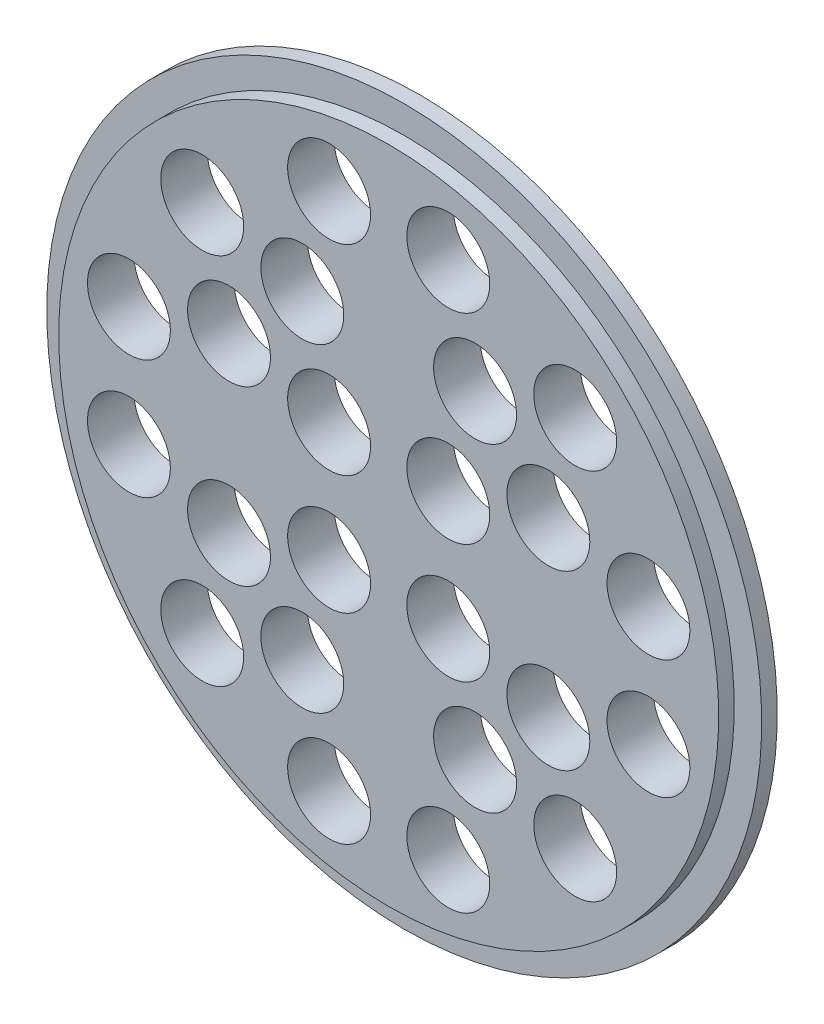
ISO-10303-21;
HEADER;
FILE_DESCRIPTION(('STEP AP214'),'2;1');
FILE_NAME('part.step','',(''),(''),'','','');
FILE_SCHEMA(('AUTOMOTIVE_DESIGN { 1 0 10303 214 1 1 1 1 }'));
ENDSEC;
DATA;
#1=APPLICATION_CONTEXT('core data for automotive mechanical design processes');
#2=APPLICATION_PROTOCOL_DEFINITION('international standard','automotive_design',2000,#1);
#3=PRODUCT_CONTEXT('',#1,'mechanical');
#4=PRODUCT('Part','Part','',(#3));
#5=PRODUCT_RELATED_PRODUCT_CATEGORY('part','',(#4));
#6=PRODUCT_DEFINITION_FORMATION('','',#4);
#7=PRODUCT_DEFINITION_CONTEXT('part definition',#1,'design');
#8=PRODUCT_DEFINITION('design','',#6,#7);
#9=PRODUCT_DEFINITION_SHAPE('','',#8);
#10=(LENGTH_UNIT() NAMED_UNIT(*) SI_UNIT(.MILLI.,.METRE.));
#11=(NAMED_UNIT(*) PLANE_ANGLE_UNIT() SI_UNIT($,.RADIAN.));
#12=(NAMED_UNIT(*) SI_UNIT($,.STERADIAN.) SOLID_ANGLE_UNIT());
#13=UNCERTAINTY_MEASURE_WITH_UNIT(LENGTH_MEASURE(1.E-05),#10,'distance_accuracy_value','');
#14=(GEOMETRIC_REPRESENTATION_CONTEXT(3) GLOBAL_UNCERTAINTY_ASSIGNED_CONTEXT((#13)) GLOBAL_UNIT_ASSIGNED_CONTEXT((#10,
#11,#12)) REPRESENTATION_CONTEXT('',''));
#15=CARTESIAN_POINT('',(0.,0.,0.));
#16=DIRECTION('',(0.,0.,1.));
#17=DIRECTION('',(1.,0.,0.));
#18=AXIS2_PLACEMENT_3D('',#15,#16,#17);
#19=CARTESIAN_POINT('',(0.,0.,0.));
#20=DIRECTION('',(0.,0.,1.));
#21=DIRECTION('',(1.,0.,0.));
#22=AXIS2_PLACEMENT_3D('',#19,#20,#21);
#23=PLANE('',#22);
#24=CARTESIAN_POINT('',(-5.74992085016783,-5.74999999999457,0.));
#25=DIRECTION('',(0.,0.,1.));
#26=DIRECTION('',(1.,0.,0.));
#27=AXIS2_PLACEMENT_3D('',#24,#25,#26);
#28=CIRCLE('',#27,4.);
#29=CARTESIAN_POINT('',(-1.74992085016783,-5.74999999999457,0.));
#30=VERTEX_POINT('',#29);
#31=EDGE_CURVE('E203',#30,#30,#28,.T.);
#32=ORIENTED_EDGE('',*,*,#31,.T.);
#33=EDGE_LOOP('',(#32));
#34=FACE_BOUND('',#33,.T.);
#35=CARTESIAN_POINT('',(-8.33811130120218,-15.4092582628828,0.));
#36=DIRECTION('',(0.,0.,1.));
#37=DIRECTION('',(1.,0.,0.));
#38=AXIS2_PLACEMENT_3D('',#35,#36,#37);
#39=CIRCLE('',#38,4.);
#40=CARTESIAN_POINT('',(-4.33811130120218,-15.4092582628828,0.));
#41=VERTEX_POINT('',#40);
#42=EDGE_CURVE('E197',#41,#41,#39,.T.);
#43=ORIENTED_EDGE('',*,*,#42,.T.);
#44=EDGE_LOOP('',(#43));
#45=FACE_BOUND('',#44,.T.);
#46=CARTESIAN_POINT('',(-17.9973695640953,-17.9974487138989,0.));
#47=DIRECTION('',(0.,0.,1.));
#48=DIRECTION('',(1.,0.,0.));
#49=AXIS2_PLACEMENT_3D('',#46,#47,#48);
#50=CIRCLE('',#49,4.);
#51=CARTESIAN_POINT('',(-13.9973695640953,-17.9974487138989,0.));
#52=VERTEX_POINT('',#51);
#53=EDGE_CURVE('E191',#52,#52,#50,.T.);
#54=ORIENTED_EDGE('',*,*,#53,.T.);
#55=EDGE_LOOP('',(#54));
#56=FACE_BOUND('',#55,.T.);
#57=CARTESIAN_POINT('',(-15.409179113061,-8.33819045101064,0.));
#58=DIRECTION('',(0.,0.,1.));
#59=DIRECTION('',(1.,0.,0.));
#60=AXIS2_PLACEMENT_3D('',#57,#58,#59);
#61=CIRCLE('',#60,3.99999999999999);
#62=CARTESIAN_POINT('',(-11.409179113061,-8.33819045101064,0.));
#63=VERTEX_POINT('',#62);
#64=EDGE_CURVE('E185',#63,#63,#61,.T.);
#65=ORIENTED_EDGE('',*,*,#64,.T.);
#66=EDGE_LOOP('',(#65));
#67=FACE_BOUND('',#66,.T.);
#68=CARTESIAN_POINT('',(-25.0684373759492,-5.74999999997635,0.));
#69=DIRECTION('',(0.,0.,1.));
#70=DIRECTION('',(1.,0.,0.));
#71=AXIS2_PLACEMENT_3D('',#68,#69,#70);
#72=CIRCLE('',#71,3.99999999999999);
#73=CARTESIAN_POINT('',(-21.0684373759492,-5.74999999997635,0.));
#74=VERTEX_POINT('',#73);
#75=EDGE_CURVE('E179',#74,#74,#72,.T.);
#76=ORIENTED_EDGE('',*,*,#75,.T.);
#77=EDGE_LOOP('',(#76));
#78=FACE_BOUND('',#77,.T.);
#79=CARTESIAN_POINT('',(-5.74992085018606,-25.0685165257759,0.));
#80=DIRECTION('',(0.,0.,1.));
#81=DIRECTION('',(1.,0.,0.));
#82=AXIS2_PLACEMENT_3D('',#79,#80,#81);
#83=CIRCLE('',#82,4.00000000000001);
#84=CARTESIAN_POINT('',(-1.74992085018605,-25.0685165257759,0.));
#85=VERTEX_POINT('',#84);
#86=EDGE_CURVE('E173',#85,#85,#83,.T.);
#87=ORIENTED_EDGE('',*,*,#86,.T.);
#88=EDGE_LOOP('',(#87));
#89=FACE_BOUND('',#88,.T.);
#90=CARTESIAN_POINT('',(0.,0.,0.));
#91=DIRECTION('',(0.,0.,-1.));
#92=DIRECTION('',(0.,1.,0.));
#93=AXIS2_PLACEMENT_3D('',#90,#91,#92);
#94=CIRCLE('',#93,31.85);
#95=CARTESIAN_POINT('',(-0.774999999999998,-31.8405696400049,0.));
#96=VERTEX_POINT('',#95);
#97=CARTESIAN_POINT('',(-31.8405696400049,-0.775000000000002,0.));
#98=VERTEX_POINT('',#97);
#99=EDGE_CURVE('E121',#96,#98,#94,.T.);
#100=ORIENTED_EDGE('',*,*,#99,.T.);
#101=DIRECTION('',(1.,0.,0.));
#102=VECTOR('',#101,1.);
#103=CARTESIAN_POINT('',(-34.5,-0.775000000000002,0.));
#104=LINE('',#103,#102);
#105=CARTESIAN_POINT('',(-0.774999999999998,-0.775000000000002,0.));
#106=VERTEX_POINT('',#105);
#107=EDGE_CURVE('E108',#98,#106,#104,.T.);
#108=ORIENTED_EDGE('',*,*,#107,.T.);
#109=DIRECTION('',(0.,1.,0.));
#110=VECTOR('',#109,1.);
#111=CARTESIAN_POINT('',(-0.774999999999998,-34.5,0.));
#112=LINE('',#111,#110);
#113=EDGE_CURVE('E297',#96,#106,#112,.T.);
#114=ORIENTED_EDGE('',*,*,#113,.F.);
#115=EDGE_LOOP('',(#100,#108,#114));
#116=FACE_BOUND('',#115,.T.);
#117=ADVANCED_FACE('F37',(#34,#45,#56,#67,#78,#89,#116),#23,.F.);
#118=CARTESIAN_POINT('',(0.,0.,0.));
#119=DIRECTION('',(0.,0.,-1.));
#120=DIRECTION('',(0.,1.,0.));
#121=AXIS2_PLACEMENT_3D('',#118,#119,#120);
#122=CYLINDRICAL_SURFACE('',#121,31.85);
#123=CARTESIAN_POINT('',(0.,0.,1.49999999999999));
#124=DIRECTION('',(0.,0.,-1.));
#125=DIRECTION('',(0.,1.,0.));
#126=AXIS2_PLACEMENT_3D('',#123,#124,#125);
#127=CIRCLE('',#126,31.85);
#128=CARTESIAN_POINT('',(-0.775,-31.8405696400049,1.49999999999999));
#129=VERTEX_POINT('',#128);
#130=CARTESIAN_POINT('',(-31.8405696400049,-0.775000000000002,1.49999999999999));
#131=VERTEX_POINT('',#130);
#132=EDGE_CURVE('E127',#129,#131,#127,.T.);
#133=ORIENTED_EDGE('',*,*,#132,.T.);
#134=DIRECTION('',(0.,0.,-1.));
#135=VECTOR('',#134,1.);
#136=CARTESIAN_POINT('',(-31.8405696400049,-0.775000000000002,0.));
#137=LINE('',#136,#135);
#138=EDGE_CURVE('E107',#131,#98,#137,.T.);
#139=ORIENTED_EDGE('',*,*,#138,.T.);
#140=ORIENTED_EDGE('',*,*,#99,.F.);
#141=DIRECTION('',(0.,0.,-1.));
#142=VECTOR('',#141,1.);
#143=CARTESIAN_POINT('',(-0.774999999999998,-31.8405696400049,0.));
#144=LINE('',#143,#142);
#145=EDGE_CURVE('E312',#96,#129,#144,.F.);
#146=ORIENTED_EDGE('',*,*,#145,.T.);
#147=EDGE_LOOP('',(#133,#139,#140,#146));
#148=FACE_BOUND('',#147,.T.);
#149=ADVANCED_FACE('F349',(#148),#122,.T.);
#150=CARTESIAN_POINT('',(-0.774999999999998,-34.5,0.));
#151=DIRECTION('',(-1.,0.,0.));
#152=DIRECTION('',(0.,0.,1.));
#153=AXIS2_PLACEMENT_3D('',#150,#151,#152);
#154=PLANE('',#153);
#155=ORIENTED_EDGE('',*,*,#113,.T.);
#156=DIRECTION('',(0.,0.,1.));
#157=VECTOR('',#156,1.);
#158=CARTESIAN_POINT('',(-0.774999999999998,-0.775000000000005,0.));
#159=LINE('',#158,#157);
#160=CARTESIAN_POINT('',(-0.774999999999998,-0.775000000000002,1.49999999999999));
#161=VERTEX_POINT('',#160);
#162=EDGE_CURVE('E11',#106,#161,#159,.T.);
#163=ORIENTED_EDGE('',*,*,#162,.T.);
#164=DIRECTION('',(0.,1.,0.));
#165=VECTOR('',#164,1.);
#166=CARTESIAN_POINT('',(-0.775,-34.5,1.49999999999999));
#167=LINE('',#166,#165);
#168=EDGE_CURVE('E304',#129,#161,#167,.T.);
#169=ORIENTED_EDGE('',*,*,#168,.F.);
#170=ORIENTED_EDGE('',*,*,#145,.F.);
#171=EDGE_LOOP('',(#155,#163,#169,#170));
#172=FACE_BOUND('',#171,.T.);
#173=ADVANCED_FACE('F355',(#172),#154,.F.);
#174=CARTESIAN_POINT('',(-25.0684769508544,5.74996042511669,0.));
#175=DIRECTION('',(0.,0.,1.));
#176=DIRECTION('',(1.,0.,0.));
#177=AXIS2_PLACEMENT_3D('',#174,#175,#176);
#178=CIRCLE('',#177,3.99999999999999);
#179=CARTESIAN_POINT('',(-21.0684769508544,5.74996042511669,0.));
#180=VERTEX_POINT('',#179);
#181=EDGE_CURVE('E132',#180,#180,#178,.T.);
#182=ORIENTED_EDGE('',*,*,#181,.T.);
#183=EDGE_LOOP('',(#182));
#184=FACE_BOUND('',#183,.T.);
#185=CARTESIAN_POINT('',(-5.74996042504572,25.0684769508707,0.));
#186=DIRECTION('',(0.,0.,1.));
#187=DIRECTION('',(1.,0.,0.));
#188=AXIS2_PLACEMENT_3D('',#185,#186,#187);
#189=CIRCLE('',#188,4.00000000000001);
#190=CARTESIAN_POINT('',(-1.7499604250457,25.0684769508707,0.));
#191=VERTEX_POINT('',#190);
#192=EDGE_CURVE('E142',#191,#191,#189,.T.);
#193=ORIENTED_EDGE('',*,*,#192,.T.);
#194=EDGE_LOOP('',(#193));
#195=FACE_BOUND('',#194,.T.);
#196=CARTESIAN_POINT('',(-8.33815087608457,15.4092186879837,0.));
#197=DIRECTION('',(0.,0.,1.));
#198=DIRECTION('',(1.,0.,0.));
#199=AXIS2_PLACEMENT_3D('',#196,#197,#198);
#200=CIRCLE('',#199,4.);
#201=CARTESIAN_POINT('',(-4.33815087608457,15.4092186879837,0.));
#202=VERTEX_POINT('',#201);
#203=EDGE_CURVE('E149',#202,#202,#200,.T.);
#204=ORIENTED_EDGE('',*,*,#203,.T.);
#205=EDGE_LOOP('',(#204));
#206=FACE_BOUND('',#205,.T.);
#207=CARTESIAN_POINT('',(-17.9974091389716,17.9974091390226,0.));
#208=DIRECTION('',(0.,0.,1.));
#209=DIRECTION('',(1.,0.,0.));
#210=AXIS2_PLACEMENT_3D('',#207,#208,#209);
#211=CIRCLE('',#210,4.);
#212=CARTESIAN_POINT('',(-13.9974091389716,17.9974091390226,0.));
#213=VERTEX_POINT('',#212);
#214=EDGE_CURVE('E155',#213,#213,#211,.T.);
#215=ORIENTED_EDGE('',*,*,#214,.T.);
#216=EDGE_LOOP('',(#215));
#217=FACE_BOUND('',#216,.T.);
#218=CARTESIAN_POINT('',(-15.4092186879601,8.33815087612825,0.));
#219=DIRECTION('',(0.,0.,1.));
#220=DIRECTION('',(1.,0.,0.));
#221=AXIS2_PLACEMENT_3D('',#218,#219,#220);
#222=CIRCLE('',#221,4.);
#223=CARTESIAN_POINT('',(-11.4092186879601,8.33815087612825,0.));
#224=VERTEX_POINT('',#223);
#225=EDGE_CURVE('E161',#224,#224,#222,.T.);
#226=ORIENTED_EDGE('',*,*,#225,.T.);
#227=EDGE_LOOP('',(#226));
#228=FACE_BOUND('',#227,.T.);
#229=CARTESIAN_POINT('',(-5.74996042507306,5.74996042508934,0.));
#230=DIRECTION('',(0.,0.,1.));
#231=DIRECTION('',(1.,0.,0.));
#232=AXIS2_PLACEMENT_3D('',#229,#230,#231);
#233=CIRCLE('',#232,4.);
#234=CARTESIAN_POINT('',(-1.74996042507306,5.74996042508934,0.));
#235=VERTEX_POINT('',#234);
#236=EDGE_CURVE('E167',#235,#235,#233,.T.);
#237=ORIENTED_EDGE('',*,*,#236,.T.);
#238=EDGE_LOOP('',(#237));
#239=FACE_BOUND('',#238,.T.);
#240=CARTESIAN_POINT('',(-0.774999999999998,0.774999999999998,0.));
#241=VERTEX_POINT('',#240);
#242=CARTESIAN_POINT('',(-0.774999999999998,31.8405696400049,0.));
#243=VERTEX_POINT('',#242);
#244=EDGE_CURVE('E115',#241,#243,#112,.T.);
#245=ORIENTED_EDGE('',*,*,#244,.F.);
#246=DIRECTION('',(1.,0.,0.));
#247=VECTOR('',#246,1.);
#248=CARTESIAN_POINT('',(-34.5,0.774999999999998,0.));
#249=LINE('',#248,#247);
#250=CARTESIAN_POINT('',(-31.8405696400049,0.774999999999998,0.));
#251=VERTEX_POINT('',#250);
#252=EDGE_CURVE('E52',#251,#241,#249,.T.);
#253=ORIENTED_EDGE('',*,*,#252,.F.);
#254=EDGE_CURVE('E113',#251,#243,#94,.T.);
#255=ORIENTED_EDGE('',*,*,#254,.T.);
#256=EDGE_LOOP('',(#245,#253,#255));
#257=FACE_BOUND('',#256,.T.);
#258=ADVANCED_FACE('F112',(#184,#195,#206,#217,#228,#239,#257),#23,.F.);
#259=ORIENTED_EDGE('',*,*,#254,.F.);
#260=DIRECTION('',(0.,0.,-1.));
#261=VECTOR('',#260,1.);
#262=CARTESIAN_POINT('',(-31.8405696400049,0.774999999999998,0.));
#263=LINE('',#262,#261);
#264=CARTESIAN_POINT('',(-31.8405696400049,0.775,1.49999999999999));
#265=VERTEX_POINT('',#264);
#266=EDGE_CURVE('E100',#251,#265,#263,.F.);
#267=ORIENTED_EDGE('',*,*,#266,.T.);
#268=CARTESIAN_POINT('',(-0.775,31.8405696400049,1.49999999999999));
#269=VERTEX_POINT('',#268);
#270=EDGE_CURVE('E129',#265,#269,#127,.T.);
#271=ORIENTED_EDGE('',*,*,#270,.T.);
#272=DIRECTION('',(0.,0.,-1.));
#273=VECTOR('',#272,1.);
#274=CARTESIAN_POINT('',(-0.774999999999998,31.8405696400049,0.));
#275=LINE('',#274,#273);
#276=EDGE_CURVE('E120',#269,#243,#275,.T.);
#277=ORIENTED_EDGE('',*,*,#276,.T.);
#278=EDGE_LOOP('',(#259,#267,#271,#277));
#279=FACE_BOUND('',#278,.T.);
#280=ADVANCED_FACE('F118',(#279),#122,.T.);
#281=CARTESIAN_POINT('',(0.,0.,4.5));
#282=DIRECTION('',(0.,0.,1.));
#283=DIRECTION('',(1.,0.,0.));
#284=AXIS2_PLACEMENT_3D('',#281,#282,#283);
#285=PLANE('',#284);
#286=CARTESIAN_POINT('',(0.,0.,4.49999999999999));
#287=DIRECTION('',(0.,0.,-1.));
#288=DIRECTION('',(0.,1.,0.));
#289=AXIS2_PLACEMENT_3D('',#286,#287,#288);
#290=CIRCLE('',#289,31.85);
#291=CARTESIAN_POINT('',(0.,31.85,4.5));
#292=VERTEX_POINT('',#291);
#293=EDGE_CURVE('E319',#292,#292,#290,.T.);
#294=ORIENTED_EDGE('',*,*,#293,.F.);
#295=EDGE_LOOP('',(#294));
#296=FACE_BOUND('',#295,.T.);
#297=CARTESIAN_POINT('',(-5.74996042504572,25.0684769508707,4.5));
#298=DIRECTION('',(0.,0.,1.));
#299=DIRECTION('',(1.,0.,0.));
#300=AXIS2_PLACEMENT_3D('',#297,#298,#299);
#301=CIRCLE('',#300,4.00000000000001);
#302=CARTESIAN_POINT('',(-1.7499604250457,25.0684769508707,4.5));
#303=VERTEX_POINT('',#302);
#304=EDGE_CURVE('E146',#303,#303,#301,.T.);
#305=ORIENTED_EDGE('',*,*,#304,.F.);
#306=EDGE_LOOP('',(#305));
#307=FACE_BOUND('',#306,.T.);
#308=CARTESIAN_POINT('',(-17.9974091389716,17.9974091390226,4.5));
#309=DIRECTION('',(0.,0.,1.));
#310=DIRECTION('',(1.,0.,0.));
#311=AXIS2_PLACEMENT_3D('',#308,#309,#310);
#312=CIRCLE('',#311,4.);
#313=CARTESIAN_POINT('',(-13.9974091389716,17.9974091390226,4.5));
#314=VERTEX_POINT('',#313);
#315=EDGE_CURVE('E158',#314,#314,#312,.T.);
#316=ORIENTED_EDGE('',*,*,#315,.F.);
#317=EDGE_LOOP('',(#316));
#318=FACE_BOUND('',#317,.T.);
#319=CARTESIAN_POINT('',(-5.74996042507306,5.74996042508934,4.5));
#320=DIRECTION('',(0.,0.,1.));
#321=DIRECTION('',(1.,0.,0.));
#322=AXIS2_PLACEMENT_3D('',#319,#320,#321);
#323=CIRCLE('',#322,4.);
#324=CARTESIAN_POINT('',(-1.74996042507306,5.74996042508934,4.5));
#325=VERTEX_POINT('',#324);
#326=EDGE_CURVE('E170',#325,#325,#323,.T.);
#327=ORIENTED_EDGE('',*,*,#326,.F.);
#328=EDGE_LOOP('',(#327));
#329=FACE_BOUND('',#328,.T.);
#330=CARTESIAN_POINT('',(-25.0684373759492,-5.74999999997635,4.5));
#331=DIRECTION('',(0.,0.,1.));
#332=DIRECTION('',(1.,0.,0.));
#333=AXIS2_PLACEMENT_3D('',#330,#331,#332);
#334=CIRCLE('',#333,3.99999999999999);
#335=CARTESIAN_POINT('',(-21.0684373759492,-5.74999999997635,4.5));
#336=VERTEX_POINT('',#335);
#337=EDGE_CURVE('E182',#336,#336,#334,.T.);
#338=ORIENTED_EDGE('',*,*,#337,.F.);
#339=EDGE_LOOP('',(#338));
#340=FACE_BOUND('',#339,.T.);
#341=CARTESIAN_POINT('',(-17.9973695640953,-17.9974487138989,4.5));
#342=DIRECTION('',(0.,0.,1.));
#343=DIRECTION('',(1.,0.,0.));
#344=AXIS2_PLACEMENT_3D('',#341,#342,#343);
#345=CIRCLE('',#344,4.);
#346=CARTESIAN_POINT('',(-13.9973695640953,-17.9974487138989,4.5));
#347=VERTEX_POINT('',#346);
#348=EDGE_CURVE('E194',#347,#347,#345,.T.);
#349=ORIENTED_EDGE('',*,*,#348,.F.);
#350=EDGE_LOOP('',(#349));
#351=FACE_BOUND('',#350,.T.);
#352=CARTESIAN_POINT('',(-5.74992085016783,-5.74999999999457,4.5));
#353=DIRECTION('',(0.,0.,1.));
#354=DIRECTION('',(1.,0.,0.));
#355=AXIS2_PLACEMENT_3D('',#352,#353,#354);
#356=CIRCLE('',#355,4.);
#357=CARTESIAN_POINT('',(-1.74992085016783,-5.74999999999457,4.5));
#358=VERTEX_POINT('',#357);
#359=EDGE_CURVE('E206',#358,#358,#356,.T.);
#360=ORIENTED_EDGE('',*,*,#359,.F.);
#361=EDGE_LOOP('',(#360));
#362=FACE_BOUND('',#361,.T.);
#363=CARTESIAN_POINT('',(5.75003957490697,-25.0684769508653,4.5));
#364=DIRECTION('',(0.,0.,1.));
#365=DIRECTION('',(1.,0.,0.));
#366=AXIS2_PLACEMENT_3D('',#363,#364,#365);
#367=CIRCLE('',#366,4.00000000000001);
#368=CARTESIAN_POINT('',(9.75003957490698,-25.0684769508653,4.5));
#369=VERTEX_POINT('',#368);
#370=EDGE_CURVE('E218',#369,#369,#367,.T.);
#371=ORIENTED_EDGE('',*,*,#370,.F.);
#372=EDGE_LOOP('',(#371));
#373=FACE_BOUND('',#372,.T.);
#374=CARTESIAN_POINT('',(17.9974882888262,-17.9974091390056,4.5));
#375=DIRECTION('',(0.,0.,1.));
#376=DIRECTION('',(1.,0.,0.));
#377=AXIS2_PLACEMENT_3D('',#374,#375,#376);
#378=CIRCLE('',#377,3.99999999999999);
#379=CARTESIAN_POINT('',(21.9974882888262,-17.9974091390056,4.5));
#380=VERTEX_POINT('',#379);
#381=EDGE_CURVE('E230',#380,#380,#378,.T.);
#382=ORIENTED_EDGE('',*,*,#381,.F.);
#383=EDGE_LOOP('',(#382));
#384=FACE_BOUND('',#383,.T.);
#385=CARTESIAN_POINT('',(5.75003957491608,-5.74996042508392,4.5));
#386=DIRECTION('',(0.,0.,1.));
#387=DIRECTION('',(1.,0.,0.));
#388=AXIS2_PLACEMENT_3D('',#385,#386,#387);
#389=CIRCLE('',#388,3.99999999999999);
#390=CARTESIAN_POINT('',(9.75003957491608,-5.74996042508392,4.5));
#391=VERTEX_POINT('',#390);
#392=EDGE_CURVE('E242',#391,#391,#389,.T.);
#393=ORIENTED_EDGE('',*,*,#392,.F.);
#394=EDGE_LOOP('',(#393));
#395=FACE_BOUND('',#394,.T.);
#396=CARTESIAN_POINT('',(25.0685165257814,5.75,4.5));
#397=DIRECTION('',(0.,0.,1.));
#398=DIRECTION('',(1.,0.,0.));
#399=AXIS2_PLACEMENT_3D('',#396,#397,#398);
#400=CIRCLE('',#399,4.00000000000003);
#401=CARTESIAN_POINT('',(29.0685165257814,5.75,4.5));
#402=VERTEX_POINT('',#401);
#403=EDGE_CURVE('E254',#402,#402,#400,.T.);
#404=ORIENTED_EDGE('',*,*,#403,.F.);
#405=EDGE_LOOP('',(#404));
#406=FACE_BOUND('',#405,.T.);
#407=CARTESIAN_POINT('',(17.9974487139159,17.9974487139159,4.5));
#408=DIRECTION('',(0.,0.,1.));
#409=DIRECTION('',(1.,0.,0.));
#410=AXIS2_PLACEMENT_3D('',#407,#408,#409);
#411=CIRCLE('',#410,3.99999999999999);
#412=CARTESIAN_POINT('',(21.9974487139159,17.9974487139159,4.5));
#413=VERTEX_POINT('',#412);
#414=EDGE_CURVE('E266',#413,#413,#411,.T.);
#415=ORIENTED_EDGE('',*,*,#414,.F.);
#416=EDGE_LOOP('',(#415));
#417=FACE_BOUND('',#416,.T.);
#418=CARTESIAN_POINT('',(5.75,5.75,4.5));
#419=DIRECTION('',(0.,0.,1.));
#420=DIRECTION('',(1.,0.,0.));
#421=AXIS2_PLACEMENT_3D('',#418,#419,#420);
#422=CIRCLE('',#421,4.);
#423=CARTESIAN_POINT('',(9.75,5.75,4.5));
#424=VERTEX_POINT('',#423);
#425=EDGE_CURVE('E278',#424,#424,#422,.T.);
#426=ORIENTED_EDGE('',*,*,#425,.F.);
#427=EDGE_LOOP('',(#426));
#428=FACE_BOUND('',#427,.T.);
#429=CARTESIAN_POINT('',(8.33819045102524,15.4092582628907,4.5));
#430=DIRECTION('',(0.,0.,1.));
#431=DIRECTION('',(1.,0.,0.));
#432=AXIS2_PLACEMENT_3D('',#429,#430,#431);
#433=CIRCLE('',#432,4.00000000000001);
#434=CARTESIAN_POINT('',(12.3381904510252,15.4092582628907,4.5));
#435=VERTEX_POINT('',#434);
#436=EDGE_CURVE('E272',#435,#435,#433,.T.);
#437=ORIENTED_EDGE('',*,*,#436,.F.);
#438=EDGE_LOOP('',(#437));
#439=FACE_BOUND('',#438,.T.);
#440=CARTESIAN_POINT('',(15.4092582628907,8.33819045102518,4.5));
#441=DIRECTION('',(0.,0.,1.));
#442=DIRECTION('',(1.,0.,0.));
#443=AXIS2_PLACEMENT_3D('',#440,#441,#442);
#444=CIRCLE('',#443,3.99999999999999);
#445=CARTESIAN_POINT('',(19.4092582628907,8.33819045102518,4.5));
#446=VERTEX_POINT('',#445);
#447=EDGE_CURVE('E260',#446,#446,#444,.T.);
#448=ORIENTED_EDGE('',*,*,#447,.F.);
#449=EDGE_LOOP('',(#448));
#450=FACE_BOUND('',#449,.T.);
#451=CARTESIAN_POINT('',(5.75,25.0685165257813,4.5));
#452=DIRECTION('',(0.,0.,1.));
#453=DIRECTION('',(1.,0.,0.));
#454=AXIS2_PLACEMENT_3D('',#451,#452,#453);
#455=CIRCLE('',#454,4.00000000000001);
#456=CARTESIAN_POINT('',(9.75000000000001,25.0685165257813,4.5));
#457=VERTEX_POINT('',#456);
#458=EDGE_CURVE('E248',#457,#457,#455,.T.);
#459=ORIENTED_EDGE('',*,*,#458,.F.);
#460=EDGE_LOOP('',(#459));
#461=FACE_BOUND('',#460,.T.);
#462=CARTESIAN_POINT('',(15.4092978378055,-8.33815087611371,4.5));
#463=DIRECTION('',(0.,0.,1.));
#464=DIRECTION('',(1.,0.,0.));
#465=AXIS2_PLACEMENT_3D('',#462,#463,#464);
#466=CIRCLE('',#465,3.99999999999999);
#467=CARTESIAN_POINT('',(19.4092978378055,-8.33815087611371,4.5));
#468=VERTEX_POINT('',#467);
#469=EDGE_CURVE('E236',#468,#468,#466,.T.);
#470=ORIENTED_EDGE('',*,*,#469,.F.);
#471=EDGE_LOOP('',(#470));
#472=FACE_BOUND('',#471,.T.);
#473=CARTESIAN_POINT('',(8.33823002593671,-15.4092186879758,4.5));
#474=DIRECTION('',(0.,0.,1.));
#475=DIRECTION('',(1.,0.,0.));
#476=AXIS2_PLACEMENT_3D('',#473,#474,#475);
#477=CIRCLE('',#476,4.);
#478=CARTESIAN_POINT('',(12.3382300259367,-15.4092186879758,4.5));
#479=VERTEX_POINT('',#478);
#480=EDGE_CURVE('E224',#479,#479,#477,.T.);
#481=ORIENTED_EDGE('',*,*,#480,.F.);
#482=EDGE_LOOP('',(#481));
#483=FACE_BOUND('',#482,.T.);
#484=CARTESIAN_POINT('',(25.0685561006974,-5.74996042509303,4.5));
#485=DIRECTION('',(0.,0.,1.));
#486=DIRECTION('',(1.,0.,0.));
#487=AXIS2_PLACEMENT_3D('',#484,#485,#486);
#488=CIRCLE('',#487,4.00000000000002);
#489=CARTESIAN_POINT('',(29.0685561006975,-5.74996042509303,4.5));
#490=VERTEX_POINT('',#489);
#491=EDGE_CURVE('E212',#490,#490,#488,.T.);
#492=ORIENTED_EDGE('',*,*,#491,.F.);
#493=EDGE_LOOP('',(#492));
#494=FACE_BOUND('',#493,.T.);
#495=CARTESIAN_POINT('',(-8.33811130120218,-15.4092582628828,4.5));
#496=DIRECTION('',(0.,0.,1.));
#497=DIRECTION('',(1.,0.,0.));
#498=AXIS2_PLACEMENT_3D('',#495,#496,#497);
#499=CIRCLE('',#498,4.);
#500=CARTESIAN_POINT('',(-4.33811130120218,-15.4092582628828,4.5));
#501=VERTEX_POINT('',#500);
#502=EDGE_CURVE('E200',#501,#501,#499,.T.);
#503=ORIENTED_EDGE('',*,*,#502,.F.);
#504=EDGE_LOOP('',(#503));
#505=FACE_BOUND('',#504,.T.);
#506=CARTESIAN_POINT('',(-15.409179113061,-8.33819045101064,4.5));
#507=DIRECTION('',(0.,0.,1.));
#508=DIRECTION('',(1.,0.,0.));
#509=AXIS2_PLACEMENT_3D('',#506,#507,#508);
#510=CIRCLE('',#509,3.99999999999999);
#511=CARTESIAN_POINT('',(-11.409179113061,-8.33819045101064,4.5));
#512=VERTEX_POINT('',#511);
#513=EDGE_CURVE('E188',#512,#512,#510,.T.);
#514=ORIENTED_EDGE('',*,*,#513,.F.);
#515=EDGE_LOOP('',(#514));
#516=FACE_BOUND('',#515,.T.);
#517=CARTESIAN_POINT('',(-5.74992085018606,-25.0685165257759,4.5));
#518=DIRECTION('',(0.,0.,1.));
#519=DIRECTION('',(1.,0.,0.));
#520=AXIS2_PLACEMENT_3D('',#517,#518,#519);
#521=CIRCLE('',#520,4.00000000000001);
#522=CARTESIAN_POINT('',(-1.74992085018605,-25.0685165257759,4.5));
#523=VERTEX_POINT('',#522);
#524=EDGE_CURVE('E176',#523,#523,#521,.T.);
#525=ORIENTED_EDGE('',*,*,#524,.F.);
#526=EDGE_LOOP('',(#525));
#527=FACE_BOUND('',#526,.T.);
#528=CARTESIAN_POINT('',(-15.4092186879601,8.33815087612825,4.5));
#529=DIRECTION('',(0.,0.,1.));
#530=DIRECTION('',(1.,0.,0.));
#531=AXIS2_PLACEMENT_3D('',#528,#529,#530);
#532=CIRCLE('',#531,4.);
#533=CARTESIAN_POINT('',(-11.4092186879601,8.33815087612825,4.5));
#534=VERTEX_POINT('',#533);
#535=EDGE_CURVE('E164',#534,#534,#532,.T.);
#536=ORIENTED_EDGE('',*,*,#535,.F.);
#537=EDGE_LOOP('',(#536));
#538=FACE_BOUND('',#537,.T.);
#539=CARTESIAN_POINT('',(-8.33815087608457,15.4092186879837,4.5));
#540=DIRECTION('',(0.,0.,1.));
#541=DIRECTION('',(1.,0.,0.));
#542=AXIS2_PLACEMENT_3D('',#539,#540,#541);
#543=CIRCLE('',#542,4.);
#544=CARTESIAN_POINT('',(-4.33815087608457,15.4092186879837,4.5));
#545=VERTEX_POINT('',#544);
#546=EDGE_CURVE('E152',#545,#545,#543,.T.);
#547=ORIENTED_EDGE('',*,*,#546,.F.);
#548=EDGE_LOOP('',(#547));
#549=FACE_BOUND('',#548,.T.);
#550=CARTESIAN_POINT('',(-25.0684769508544,5.74996042511669,4.5));
#551=DIRECTION('',(0.,0.,1.));
#552=DIRECTION('',(1.,0.,0.));
#553=AXIS2_PLACEMENT_3D('',#550,#551,#552);
#554=CIRCLE('',#553,3.99999999999999);
#555=CARTESIAN_POINT('',(-21.0684769508544,5.74996042511669,4.5));
#556=VERTEX_POINT('',#555);
#557=EDGE_CURVE('E137',#556,#556,#554,.T.);
#558=ORIENTED_EDGE('',*,*,#557,.F.);
#559=EDGE_LOOP('',(#558));
#560=FACE_BOUND('',#559,.T.);
#561=ADVANCED_FACE('F363',(#296,#307,#318,#329,#340,#351,#362,#373,#384,#395,#406,#417,#428,
#439,#450,#461,#472,#483,#494,#505,#516,#527,#538,#549,#560),#285,.T.);
#562=CARTESIAN_POINT('',(0.775,31.8405696400049,0.));
#563=VERTEX_POINT('',#562);
#564=CARTESIAN_POINT('',(0.775,-31.8405696400049,0.));
#565=VERTEX_POINT('',#564);
#566=EDGE_CURVE('E124',#563,#565,#94,.T.);
#567=ORIENTED_EDGE('',*,*,#566,.T.);
#568=DIRECTION('',(0.,1.,0.));
#569=VECTOR('',#568,1.);
#570=CARTESIAN_POINT('',(0.775,-34.5,0.));
#571=LINE('',#570,#569);
#572=EDGE_CURVE('E301',#565,#563,#571,.T.);
#573=ORIENTED_EDGE('',*,*,#572,.T.);
#574=EDGE_LOOP('',(#567,#573));
#575=FACE_BOUND('',#574,.T.);
#576=CARTESIAN_POINT('',(5.75,5.75,0.));
#577=DIRECTION('',(0.,0.,1.));
#578=DIRECTION('',(1.,0.,0.));
#579=AXIS2_PLACEMENT_3D('',#576,#577,#578);
#580=CIRCLE('',#579,4.);
#581=CARTESIAN_POINT('',(9.75,5.75,0.));
#582=VERTEX_POINT('',#581);
#583=EDGE_CURVE('E275',#582,#582,#580,.T.);
#584=ORIENTED_EDGE('',*,*,#583,.T.);
#585=EDGE_LOOP('',(#584));
#586=FACE_BOUND('',#585,.T.);
#587=CARTESIAN_POINT('',(8.33819045102524,15.4092582628907,0.));
#588=DIRECTION('',(0.,0.,1.));
#589=DIRECTION('',(1.,0.,0.));
#590=AXIS2_PLACEMENT_3D('',#587,#588,#589);
#591=CIRCLE('',#590,4.00000000000001);
#592=CARTESIAN_POINT('',(12.3381904510252,15.4092582628907,0.));
#593=VERTEX_POINT('',#592);
#594=EDGE_CURVE('E269',#593,#593,#591,.T.);
#595=ORIENTED_EDGE('',*,*,#594,.T.);
#596=EDGE_LOOP('',(#595));
#597=FACE_BOUND('',#596,.T.);
#598=CARTESIAN_POINT('',(17.9974487139159,17.9974487139159,0.));
#599=DIRECTION('',(0.,0.,1.));
#600=DIRECTION('',(1.,0.,0.));
#601=AXIS2_PLACEMENT_3D('',#598,#599,#600);
#602=CIRCLE('',#601,3.99999999999999);
#603=CARTESIAN_POINT('',(21.9974487139159,17.9974487139159,0.));
#604=VERTEX_POINT('',#603);
#605=EDGE_CURVE('E263',#604,#604,#602,.T.);
#606=ORIENTED_EDGE('',*,*,#605,.T.);
#607=EDGE_LOOP('',(#606));
#608=FACE_BOUND('',#607,.T.);
#609=CARTESIAN_POINT('',(15.4092582628907,8.33819045102518,0.));
#610=DIRECTION('',(0.,0.,1.));
#611=DIRECTION('',(1.,0.,0.));
#612=AXIS2_PLACEMENT_3D('',#609,#610,#611);
#613=CIRCLE('',#612,3.99999999999999);
#614=CARTESIAN_POINT('',(19.4092582628907,8.33819045102518,0.));
#615=VERTEX_POINT('',#614);
#616=EDGE_CURVE('E257',#615,#615,#613,.T.);
#617=ORIENTED_EDGE('',*,*,#616,.T.);
#618=EDGE_LOOP('',(#617));
#619=FACE_BOUND('',#618,.T.);
#620=CARTESIAN_POINT('',(25.0685165257814,5.75,0.));
#621=DIRECTION('',(0.,0.,1.));
#622=DIRECTION('',(1.,0.,0.));
#623=AXIS2_PLACEMENT_3D('',#620,#621,#622);
#624=CIRCLE('',#623,4.00000000000003);
#625=CARTESIAN_POINT('',(29.0685165257814,5.75,0.));
#626=VERTEX_POINT('',#625);
#627=EDGE_CURVE('E251',#626,#626,#624,.T.);
#628=ORIENTED_EDGE('',*,*,#627,.T.);
#629=EDGE_LOOP('',(#628));
#630=FACE_BOUND('',#629,.T.);
#631=CARTESIAN_POINT('',(5.75,25.0685165257813,0.));
#632=DIRECTION('',(0.,0.,1.));
#633=DIRECTION('',(1.,0.,0.));
#634=AXIS2_PLACEMENT_3D('',#631,#632,#633);
#635=CIRCLE('',#634,4.00000000000001);
#636=CARTESIAN_POINT('',(9.75000000000001,25.0685165257813,0.));
#637=VERTEX_POINT('',#636);
#638=EDGE_CURVE('E245',#637,#637,#635,.T.);
#639=ORIENTED_EDGE('',*,*,#638,.T.);
#640=EDGE_LOOP('',(#639));
#641=FACE_BOUND('',#640,.T.);
#642=CARTESIAN_POINT('',(5.75003957491608,-5.74996042508392,0.));
#643=DIRECTION('',(0.,0.,1.));
#644=DIRECTION('',(1.,0.,0.));
#645=AXIS2_PLACEMENT_3D('',#642,#643,#644);
#646=CIRCLE('',#645,3.99999999999999);
#647=CARTESIAN_POINT('',(9.75003957491608,-5.74996042508392,0.));
#648=VERTEX_POINT('',#647);
#649=EDGE_CURVE('E239',#648,#648,#646,.T.);
#650=ORIENTED_EDGE('',*,*,#649,.T.);
#651=EDGE_LOOP('',(#650));
#652=FACE_BOUND('',#651,.T.);
#653=CARTESIAN_POINT('',(15.4092978378055,-8.33815087611371,0.));
#654=DIRECTION('',(0.,0.,1.));
#655=DIRECTION('',(1.,0.,0.));
#656=AXIS2_PLACEMENT_3D('',#653,#654,#655);
#657=CIRCLE('',#656,3.99999999999999);
#658=CARTESIAN_POINT('',(19.4092978378055,-8.33815087611371,0.));
#659=VERTEX_POINT('',#658);
#660=EDGE_CURVE('E233',#659,#659,#657,.T.);
#661=ORIENTED_EDGE('',*,*,#660,.T.);
#662=EDGE_LOOP('',(#661));
#663=FACE_BOUND('',#662,.T.);
#664=CARTESIAN_POINT('',(17.9974882888262,-17.9974091390056,0.));
#665=DIRECTION('',(0.,0.,1.));
#666=DIRECTION('',(1.,0.,0.));
#667=AXIS2_PLACEMENT_3D('',#664,#665,#666);
#668=CIRCLE('',#667,3.99999999999999);
#669=CARTESIAN_POINT('',(21.9974882888262,-17.9974091390056,0.));
#670=VERTEX_POINT('',#669);
#671=EDGE_CURVE('E227',#670,#670,#668,.T.);
#672=ORIENTED_EDGE('',*,*,#671,.T.);
#673=EDGE_LOOP('',(#672));
#674=FACE_BOUND('',#673,.T.);
#675=CARTESIAN_POINT('',(8.33823002593671,-15.4092186879758,0.));
#676=DIRECTION('',(0.,0.,1.));
#677=DIRECTION('',(1.,0.,0.));
#678=AXIS2_PLACEMENT_3D('',#675,#676,#677);
#679=CIRCLE('',#678,4.);
#680=CARTESIAN_POINT('',(12.3382300259367,-15.4092186879758,0.));
#681=VERTEX_POINT('',#680);
#682=EDGE_CURVE('E221',#681,#681,#679,.T.);
#683=ORIENTED_EDGE('',*,*,#682,.T.);
#684=EDGE_LOOP('',(#683));
#685=FACE_BOUND('',#684,.T.);
#686=CARTESIAN_POINT('',(5.75003957490697,-25.0684769508653,0.));
#687=DIRECTION('',(0.,0.,1.));
#688=DIRECTION('',(1.,0.,0.));
#689=AXIS2_PLACEMENT_3D('',#686,#687,#688);
#690=CIRCLE('',#689,4.00000000000001);
#691=CARTESIAN_POINT('',(9.75003957490698,-25.0684769508653,0.));
#692=VERTEX_POINT('',#691);
#693=EDGE_CURVE('E215',#692,#692,#690,.T.);
#694=ORIENTED_EDGE('',*,*,#693,.T.);
#695=EDGE_LOOP('',(#694));
#696=FACE_BOUND('',#695,.T.);
#697=CARTESIAN_POINT('',(25.0685561006974,-5.74996042509303,0.));
#698=DIRECTION('',(0.,0.,1.));
#699=DIRECTION('',(1.,0.,0.));
#700=AXIS2_PLACEMENT_3D('',#697,#698,#699);
#701=CIRCLE('',#700,4.00000000000002);
#702=CARTESIAN_POINT('',(29.0685561006975,-5.74996042509303,0.));
#703=VERTEX_POINT('',#702);
#704=EDGE_CURVE('E209',#703,#703,#701,.T.);
#705=ORIENTED_EDGE('',*,*,#704,.T.);
#706=EDGE_LOOP('',(#705));
#707=FACE_BOUND('',#706,.T.);
#708=ADVANCED_FACE('F351',(#575,#586,#597,#608,#619,#630,#641,#652,#663,#674,#685,#696,#707),
#23,.F.);
#709=CARTESIAN_POINT('',(5.75,5.75,4.5));
#710=DIRECTION('',(0.,0.,-1.));
#711=DIRECTION('',(-1.,0.,0.));
#712=AXIS2_PLACEMENT_3D('',#709,#710,#711);
#713=CYLINDRICAL_SURFACE('',#712,4.);
#714=ORIENTED_EDGE('',*,*,#425,.T.);
#715=EDGE_LOOP('',(#714));
#716=FACE_BOUND('',#715,.T.);
#717=ORIENTED_EDGE('',*,*,#583,.F.);
#718=EDGE_LOOP('',(#717));
#719=FACE_BOUND('',#718,.T.);
#720=ADVANCED_FACE('F362',(#716,#719),#713,.F.);
#721=CARTESIAN_POINT('',(8.33819045102524,15.4092582628907,4.5));
#722=DIRECTION('',(0.,0.,-1.));
#723=DIRECTION('',(-1.,0.,0.));
#724=AXIS2_PLACEMENT_3D('',#721,#722,#723);
#725=CYLINDRICAL_SURFACE('',#724,4.00000000000001);
#726=ORIENTED_EDGE('',*,*,#436,.T.);
#727=EDGE_LOOP('',(#726));
#728=FACE_BOUND('',#727,.T.);
#729=ORIENTED_EDGE('',*,*,#594,.F.);
#730=EDGE_LOOP('',(#729));
#731=FACE_BOUND('',#730,.T.);
#732=ADVANCED_FACE('F368',(#728,#731),#725,.F.);
#733=CARTESIAN_POINT('',(17.9974487139159,17.9974487139159,4.5));
#734=DIRECTION('',(0.,0.,-1.));
#735=DIRECTION('',(-1.,0.,0.));
#736=AXIS2_PLACEMENT_3D('',#733,#734,#735);
#737=CYLINDRICAL_SURFACE('',#736,3.99999999999999);
#738=ORIENTED_EDGE('',*,*,#414,.T.);
#739=EDGE_LOOP('',(#738));
#740=FACE_BOUND('',#739,.T.);
#741=ORIENTED_EDGE('',*,*,#605,.F.);
#742=EDGE_LOOP('',(#741));
#743=FACE_BOUND('',#742,.T.);
#744=ADVANCED_FACE('F441',(#740,#743),#737,.F.);
#745=CARTESIAN_POINT('',(15.4092582628907,8.33819045102518,4.5));
#746=DIRECTION('',(0.,0.,-1.));
#747=DIRECTION('',(-1.,0.,0.));
#748=AXIS2_PLACEMENT_3D('',#745,#746,#747);
#749=CYLINDRICAL_SURFACE('',#748,3.99999999999999);
#750=ORIENTED_EDGE('',*,*,#447,.T.);
#751=EDGE_LOOP('',(#750));
#752=FACE_BOUND('',#751,.T.);
#753=ORIENTED_EDGE('',*,*,#616,.F.);
#754=EDGE_LOOP('',(#753));
#755=FACE_BOUND('',#754,.T.);
#756=ADVANCED_FACE('F437',(#752,#755),#749,.F.);
#757=CARTESIAN_POINT('',(25.0685165257814,5.75,4.5));
#758=DIRECTION('',(0.,0.,-1.));
#759=DIRECTION('',(-1.,0.,0.));
#760=AXIS2_PLACEMENT_3D('',#757,#758,#759);
#761=CYLINDRICAL_SURFACE('',#760,4.00000000000003);
#762=ORIENTED_EDGE('',*,*,#403,.T.);
#763=EDGE_LOOP('',(#762));
#764=FACE_BOUND('',#763,.T.);
#765=ORIENTED_EDGE('',*,*,#627,.F.);
#766=EDGE_LOOP('',(#765));
#767=FACE_BOUND('',#766,.T.);
#768=ADVANCED_FACE('F433',(#764,#767),#761,.F.);
#769=CARTESIAN_POINT('',(5.75,25.0685165257813,4.5));
#770=DIRECTION('',(0.,0.,-1.));
#771=DIRECTION('',(-1.,0.,0.));
#772=AXIS2_PLACEMENT_3D('',#769,#770,#771);
#773=CYLINDRICAL_SURFACE('',#772,4.00000000000001);
#774=ORIENTED_EDGE('',*,*,#458,.T.);
#775=EDGE_LOOP('',(#774));
#776=FACE_BOUND('',#775,.T.);
#777=ORIENTED_EDGE('',*,*,#638,.F.);
#778=EDGE_LOOP('',(#777));
#779=FACE_BOUND('',#778,.T.);
#780=ADVANCED_FACE('F429',(#776,#779),#773,.F.);
#781=CARTESIAN_POINT('',(5.75003957491608,-5.74996042508392,4.5));
#782=DIRECTION('',(0.,0.,-1.));
#783=DIRECTION('',(-1.,0.,0.));
#784=AXIS2_PLACEMENT_3D('',#781,#782,#783);
#785=CYLINDRICAL_SURFACE('',#784,3.99999999999999);
#786=ORIENTED_EDGE('',*,*,#392,.T.);
#787=EDGE_LOOP('',(#786));
#788=FACE_BOUND('',#787,.T.);
#789=ORIENTED_EDGE('',*,*,#649,.F.);
#790=EDGE_LOOP('',(#789));
#791=FACE_BOUND('',#790,.T.);
#792=ADVANCED_FACE('F425',(#788,#791),#785,.F.);
#793=CARTESIAN_POINT('',(15.4092978378055,-8.33815087611371,4.5));
#794=DIRECTION('',(0.,0.,-1.));
#795=DIRECTION('',(-1.,0.,0.));
#796=AXIS2_PLACEMENT_3D('',#793,#794,#795);
#797=CYLINDRICAL_SURFACE('',#796,3.99999999999999);
#798=ORIENTED_EDGE('',*,*,#469,.T.);
#799=EDGE_LOOP('',(#798));
#800=FACE_BOUND('',#799,.T.);
#801=ORIENTED_EDGE('',*,*,#660,.F.);
#802=EDGE_LOOP('',(#801));
#803=FACE_BOUND('',#802,.T.);
#804=ADVANCED_FACE('F421',(#800,#803),#797,.F.);
#805=CARTESIAN_POINT('',(17.9974882888262,-17.9974091390056,4.5));
#806=DIRECTION('',(0.,0.,-1.));
#807=DIRECTION('',(-1.,0.,0.));
#808=AXIS2_PLACEMENT_3D('',#805,#806,#807);
#809=CYLINDRICAL_SURFACE('',#808,3.99999999999999);
#810=ORIENTED_EDGE('',*,*,#381,.T.);
#811=EDGE_LOOP('',(#810));
#812=FACE_BOUND('',#811,.T.);
#813=ORIENTED_EDGE('',*,*,#671,.F.);
#814=EDGE_LOOP('',(#813));
#815=FACE_BOUND('',#814,.T.);
#816=ADVANCED_FACE('F417',(#812,#815),#809,.F.);
#817=CARTESIAN_POINT('',(8.33823002593671,-15.4092186879758,4.5));
#818=DIRECTION('',(0.,0.,-1.));
#819=DIRECTION('',(-1.,0.,0.));
#820=AXIS2_PLACEMENT_3D('',#817,#818,#819);
#821=CYLINDRICAL_SURFACE('',#820,4.);
#822=ORIENTED_EDGE('',*,*,#480,.T.);
#823=EDGE_LOOP('',(#822));
#824=FACE_BOUND('',#823,.T.);
#825=ORIENTED_EDGE('',*,*,#682,.F.);
#826=EDGE_LOOP('',(#825));
#827=FACE_BOUND('',#826,.T.);
#828=ADVANCED_FACE('F410',(#824,#827),#821,.F.);
#829=CARTESIAN_POINT('',(5.75003957490697,-25.0684769508653,4.5));
#830=DIRECTION('',(0.,0.,-1.));
#831=DIRECTION('',(-1.,0.,0.));
#832=AXIS2_PLACEMENT_3D('',#829,#830,#831);
#833=CYLINDRICAL_SURFACE('',#832,4.00000000000001);
#834=ORIENTED_EDGE('',*,*,#370,.T.);
#835=EDGE_LOOP('',(#834));
#836=FACE_BOUND('',#835,.T.);
#837=ORIENTED_EDGE('',*,*,#693,.F.);
#838=EDGE_LOOP('',(#837));
#839=FACE_BOUND('',#838,.T.);
#840=ADVANCED_FACE('F400',(#836,#839),#833,.F.);
#841=CARTESIAN_POINT('',(25.0685561006974,-5.74996042509303,4.5));
#842=DIRECTION('',(0.,0.,-1.));
#843=DIRECTION('',(-1.,0.,0.));
#844=AXIS2_PLACEMENT_3D('',#841,#842,#843);
#845=CYLINDRICAL_SURFACE('',#844,4.00000000000002);
#846=ORIENTED_EDGE('',*,*,#491,.T.);
#847=EDGE_LOOP('',(#846));
#848=FACE_BOUND('',#847,.T.);
#849=ORIENTED_EDGE('',*,*,#704,.F.);
#850=EDGE_LOOP('',(#849));
#851=FACE_BOUND('',#850,.T.);
#852=ADVANCED_FACE('F397',(#848,#851),#845,.F.);
#853=CARTESIAN_POINT('',(-5.74992085016783,-5.74999999999457,4.5));
#854=DIRECTION('',(0.,0.,-1.));
#855=DIRECTION('',(-1.,0.,0.));
#856=AXIS2_PLACEMENT_3D('',#853,#854,#855);
#857=CYLINDRICAL_SURFACE('',#856,4.);
#858=ORIENTED_EDGE('',*,*,#359,.T.);
#859=EDGE_LOOP('',(#858));
#860=FACE_BOUND('',#859,.T.);
#861=ORIENTED_EDGE('',*,*,#31,.F.);
#862=EDGE_LOOP('',(#861));
#863=FACE_BOUND('',#862,.T.);
#864=ADVANCED_FACE('F399',(#860,#863),#857,.F.);
#865=CARTESIAN_POINT('',(-8.33811130120218,-15.4092582628828,4.5));
#866=DIRECTION('',(0.,0.,-1.));
#867=DIRECTION('',(-1.,0.,0.));
#868=AXIS2_PLACEMENT_3D('',#865,#866,#867);
#869=CYLINDRICAL_SURFACE('',#868,4.);
#870=ORIENTED_EDGE('',*,*,#502,.T.);
#871=EDGE_LOOP('',(#870));
#872=FACE_BOUND('',#871,.T.);
#873=ORIENTED_EDGE('',*,*,#42,.F.);
#874=EDGE_LOOP('',(#873));
#875=FACE_BOUND('',#874,.T.);
#876=ADVANCED_FACE('F407',(#872,#875),#869,.F.);
#877=CARTESIAN_POINT('',(-17.9973695640953,-17.9974487138989,4.5));
#878=DIRECTION('',(0.,0.,-1.));
#879=DIRECTION('',(-1.,0.,0.));
#880=AXIS2_PLACEMENT_3D('',#877,#878,#879);
#881=CYLINDRICAL_SURFACE('',#880,4.);
#882=ORIENTED_EDGE('',*,*,#348,.T.);
#883=EDGE_LOOP('',(#882));
#884=FACE_BOUND('',#883,.T.);
#885=ORIENTED_EDGE('',*,*,#53,.F.);
#886=EDGE_LOOP('',(#885));
#887=FACE_BOUND('',#886,.T.);
#888=ADVANCED_FACE('F514',(#884,#887),#881,.F.);
#889=CARTESIAN_POINT('',(-15.409179113061,-8.33819045101064,4.5));
#890=DIRECTION('',(0.,0.,-1.));
#891=DIRECTION('',(-1.,0.,0.));
#892=AXIS2_PLACEMENT_3D('',#889,#890,#891);
#893=CYLINDRICAL_SURFACE('',#892,3.99999999999999);
#894=ORIENTED_EDGE('',*,*,#513,.T.);
#895=EDGE_LOOP('',(#894));
#896=FACE_BOUND('',#895,.T.);
#897=ORIENTED_EDGE('',*,*,#64,.F.);
#898=EDGE_LOOP('',(#897));
#899=FACE_BOUND('',#898,.T.);
#900=ADVANCED_FACE('F510',(#896,#899),#893,.F.);
#901=CARTESIAN_POINT('',(-25.0684373759492,-5.74999999997635,4.5));
#902=DIRECTION('',(0.,0.,-1.));
#903=DIRECTION('',(-1.,0.,0.));
#904=AXIS2_PLACEMENT_3D('',#901,#902,#903);
#905=CYLINDRICAL_SURFACE('',#904,3.99999999999999);
#906=ORIENTED_EDGE('',*,*,#337,.T.);
#907=EDGE_LOOP('',(#906));
#908=FACE_BOUND('',#907,.T.);
#909=ORIENTED_EDGE('',*,*,#75,.F.);
#910=EDGE_LOOP('',(#909));
#911=FACE_BOUND('',#910,.T.);
#912=ADVANCED_FACE('F503',(#908,#911),#905,.F.);
#913=CARTESIAN_POINT('',(-5.74992085018606,-25.0685165257759,4.5));
#914=DIRECTION('',(0.,0.,-1.));
#915=DIRECTION('',(-1.,0.,0.));
#916=AXIS2_PLACEMENT_3D('',#913,#914,#915);
#917=CYLINDRICAL_SURFACE('',#916,4.00000000000001);
#918=ORIENTED_EDGE('',*,*,#524,.T.);
#919=EDGE_LOOP('',(#918));
#920=FACE_BOUND('',#919,.T.);
#921=ORIENTED_EDGE('',*,*,#86,.F.);
#922=EDGE_LOOP('',(#921));
#923=FACE_BOUND('',#922,.T.);
#924=ADVANCED_FACE('F494',(#920,#923),#917,.F.);
#925=CARTESIAN_POINT('',(-5.74996042507306,5.74996042508934,4.5));
#926=DIRECTION('',(0.,0.,-1.));
#927=DIRECTION('',(-1.,0.,0.));
#928=AXIS2_PLACEMENT_3D('',#925,#926,#927);
#929=CYLINDRICAL_SURFACE('',#928,4.);
#930=ORIENTED_EDGE('',*,*,#326,.T.);
#931=EDGE_LOOP('',(#930));
#932=FACE_BOUND('',#931,.T.);
#933=ORIENTED_EDGE('',*,*,#236,.F.);
#934=EDGE_LOOP('',(#933));
#935=FACE_BOUND('',#934,.T.);
#936=ADVANCED_FACE('F491',(#932,#935),#929,.F.);
#937=CARTESIAN_POINT('',(-15.4092186879601,8.33815087612825,4.5));
#938=DIRECTION('',(0.,0.,-1.));
#939=DIRECTION('',(-1.,0.,0.));
#940=AXIS2_PLACEMENT_3D('',#937,#938,#939);
#941=CYLINDRICAL_SURFACE('',#940,4.);
#942=ORIENTED_EDGE('',*,*,#535,.T.);
#943=EDGE_LOOP('',(#942));
#944=FACE_BOUND('',#943,.T.);
#945=ORIENTED_EDGE('',*,*,#225,.F.);
#946=EDGE_LOOP('',(#945));
#947=FACE_BOUND('',#946,.T.);
#948=ADVANCED_FACE('F493',(#944,#947),#941,.F.);
#949=CARTESIAN_POINT('',(-17.9974091389716,17.9974091390226,4.5));
#950=DIRECTION('',(0.,0.,-1.));
#951=DIRECTION('',(-1.,0.,0.));
#952=AXIS2_PLACEMENT_3D('',#949,#950,#951);
#953=CYLINDRICAL_SURFACE('',#952,4.);
#954=ORIENTED_EDGE('',*,*,#315,.T.);
#955=EDGE_LOOP('',(#954));
#956=FACE_BOUND('',#955,.T.);
#957=ORIENTED_EDGE('',*,*,#214,.F.);
#958=EDGE_LOOP('',(#957));
#959=FACE_BOUND('',#958,.T.);
#960=ADVANCED_FACE('F480',(#956,#959),#953,.F.);
#961=CARTESIAN_POINT('',(-8.33815087608457,15.4092186879837,4.5));
#962=DIRECTION('',(0.,0.,-1.));
#963=DIRECTION('',(-1.,0.,0.));
#964=AXIS2_PLACEMENT_3D('',#961,#962,#963);
#965=CYLINDRICAL_SURFACE('',#964,4.);
#966=ORIENTED_EDGE('',*,*,#546,.T.);
#967=EDGE_LOOP('',(#966));
#968=FACE_BOUND('',#967,.T.);
#969=ORIENTED_EDGE('',*,*,#203,.F.);
#970=EDGE_LOOP('',(#969));
#971=FACE_BOUND('',#970,.T.);
#972=ADVANCED_FACE('F477',(#968,#971),#965,.F.);
#973=CARTESIAN_POINT('',(-5.74996042504572,25.0684769508707,4.5));
#974=DIRECTION('',(0.,0.,-1.));
#975=DIRECTION('',(-1.,0.,0.));
#976=AXIS2_PLACEMENT_3D('',#973,#974,#975);
#977=CYLINDRICAL_SURFACE('',#976,4.00000000000001);
#978=ORIENTED_EDGE('',*,*,#304,.T.);
#979=EDGE_LOOP('',(#978));
#980=FACE_BOUND('',#979,.T.);
#981=ORIENTED_EDGE('',*,*,#192,.F.);
#982=EDGE_LOOP('',(#981));
#983=FACE_BOUND('',#982,.T.);
#984=ADVANCED_FACE('F345',(#980,#983),#977,.F.);
#985=CARTESIAN_POINT('',(-25.0684769508544,5.74996042511669,4.5));
#986=DIRECTION('',(0.,0.,-1.));
#987=DIRECTION('',(-1.,0.,0.));
#988=AXIS2_PLACEMENT_3D('',#985,#986,#987);
#989=CYLINDRICAL_SURFACE('',#988,3.99999999999999);
#990=ORIENTED_EDGE('',*,*,#557,.T.);
#991=EDGE_LOOP('',(#990));
#992=FACE_BOUND('',#991,.T.);
#993=ORIENTED_EDGE('',*,*,#181,.F.);
#994=EDGE_LOOP('',(#993));
#995=FACE_BOUND('',#994,.T.);
#996=ADVANCED_FACE('F340',(#992,#995),#989,.F.);
#997=CARTESIAN_POINT('',(0.,0.,0.));
#998=DIRECTION('',(0.,0.,-1.));
#999=DIRECTION('',(0.,1.,0.));
#1000=AXIS2_PLACEMENT_3D('',#997,#998,#999);
#1001=CYLINDRICAL_SURFACE('',#1000,31.85);
#1002=CARTESIAN_POINT('',(0.,0.,2.99999999999999));
#1003=DIRECTION('',(0.,0.,-1.));
#1004=DIRECTION('',(0.,1.,0.));
#1005=AXIS2_PLACEMENT_3D('',#1002,#1003,#1004);
#1006=CIRCLE('',#1005,31.85);
#1007=CARTESIAN_POINT('',(0.,31.85,3.));
#1008=VERTEX_POINT('',#1007);
#1009=EDGE_CURVE('E322',#1008,#1008,#1006,.T.);
#1010=ORIENTED_EDGE('',*,*,#1009,.F.);
#1011=EDGE_LOOP('',(#1010));
#1012=FACE_BOUND('',#1011,.T.);
#1013=ORIENTED_EDGE('',*,*,#293,.T.);
#1014=EDGE_LOOP('',(#1013));
#1015=FACE_BOUND('',#1014,.T.);
#1016=ADVANCED_FACE('F335',(#1012,#1015),#1001,.T.);
#1017=CARTESIAN_POINT('',(0.,34.5,3.));
#1018=DIRECTION('',(0.,0.,-1.));
#1019=DIRECTION('',(0.,1.,0.));
#1020=AXIS2_PLACEMENT_3D('',#1017,#1018,#1019);
#1021=PLANE('',#1020);
#1022=CARTESIAN_POINT('',(0.,0.,2.99999999999999));
#1023=DIRECTION('',(0.,0.,-1.));
#1024=DIRECTION('',(0.,1.,0.));
#1025=AXIS2_PLACEMENT_3D('',#1022,#1023,#1024);
#1026=CIRCLE('',#1025,34.5);
#1027=CARTESIAN_POINT('',(0.,34.5,3.));
#1028=VERTEX_POINT('',#1027);
#1029=EDGE_CURVE('E316',#1028,#1028,#1026,.T.);
#1030=ORIENTED_EDGE('',*,*,#1029,.F.);
#1031=EDGE_LOOP('',(#1030));
#1032=FACE_BOUND('',#1031,.T.);
#1033=ORIENTED_EDGE('',*,*,#1009,.T.);
#1034=EDGE_LOOP('',(#1033));
#1035=FACE_BOUND('',#1034,.T.);
#1036=ADVANCED_FACE('F331',(#1032,#1035),#1021,.F.);
#1037=CARTESIAN_POINT('',(0.775,31.8405696400049,1.49999999999999));
#1038=VERTEX_POINT('',#1037);
#1039=CARTESIAN_POINT('',(0.775,-31.8405696400049,1.49999999999999));
#1040=VERTEX_POINT('',#1039);
#1041=EDGE_CURVE('E122',#1038,#1040,#127,.T.);
#1042=ORIENTED_EDGE('',*,*,#1041,.T.);
#1043=DIRECTION('',(0.,0.,-1.));
#1044=VECTOR('',#1043,1.);
#1045=CARTESIAN_POINT('',(0.775,-31.8405696400049,0.));
#1046=LINE('',#1045,#1044);
#1047=EDGE_CURVE('E309',#1040,#565,#1046,.T.);
#1048=ORIENTED_EDGE('',*,*,#1047,.T.);
#1049=ORIENTED_EDGE('',*,*,#566,.F.);
#1050=DIRECTION('',(0.,0.,-1.));
#1051=VECTOR('',#1050,1.);
#1052=CARTESIAN_POINT('',(0.775,31.8405696400049,0.));
#1053=LINE('',#1052,#1051);
#1054=EDGE_CURVE('E300',#563,#1038,#1053,.F.);
#1055=ORIENTED_EDGE('',*,*,#1054,.T.);
#1056=EDGE_LOOP('',(#1042,#1048,#1049,#1055));
#1057=FACE_BOUND('',#1056,.T.);
#1058=ADVANCED_FACE('F334',(#1057),#122,.T.);
#1059=CARTESIAN_POINT('',(0.,34.5,1.5));
#1060=DIRECTION('',(0.,0.,1.));
#1061=DIRECTION('',(0.,-1.,0.));
#1062=AXIS2_PLACEMENT_3D('',#1059,#1060,#1061);
#1063=PLANE('',#1062);
#1064=DIRECTION('',(1.,0.,0.));
#1065=VECTOR('',#1064,1.);
#1066=CARTESIAN_POINT('',(-34.5,-0.775000000000002,1.49999999999999));
#1067=LINE('',#1066,#1065);
#1068=EDGE_CURVE('E290',#131,#161,#1067,.T.);
#1069=ORIENTED_EDGE('',*,*,#1068,.F.);
#1070=ORIENTED_EDGE('',*,*,#132,.F.);
#1071=ORIENTED_EDGE('',*,*,#168,.T.);
#1072=EDGE_LOOP('',(#1069,#1070,#1071));
#1073=FACE_BOUND('',#1072,.T.);
#1074=ORIENTED_EDGE('',*,*,#270,.F.);
#1075=DIRECTION('',(1.,0.,0.));
#1076=VECTOR('',#1075,1.);
#1077=CARTESIAN_POINT('',(-34.5,0.775,1.49999999999999));
#1078=LINE('',#1077,#1076);
#1079=CARTESIAN_POINT('',(-0.774999999999998,0.775,1.49999999999999));
#1080=VERTEX_POINT('',#1079);
#1081=EDGE_CURVE('E103',#265,#1080,#1078,.T.);
#1082=ORIENTED_EDGE('',*,*,#1081,.T.);
#1083=EDGE_CURVE('E286',#1080,#269,#167,.T.);
#1084=ORIENTED_EDGE('',*,*,#1083,.T.);
#1085=EDGE_LOOP('',(#1074,#1082,#1084));
#1086=FACE_BOUND('',#1085,.T.);
#1087=CARTESIAN_POINT('',(0.,0.,1.49999999999999));
#1088=DIRECTION('',(0.,0.,-1.));
#1089=DIRECTION('',(0.,1.,0.));
#1090=AXIS2_PLACEMENT_3D('',#1087,#1088,#1089);
#1091=CIRCLE('',#1090,34.5);
#1092=CARTESIAN_POINT('',(0.,34.5,1.5));
#1093=VERTEX_POINT('',#1092);
#1094=EDGE_CURVE('E317',#1093,#1093,#1091,.T.);
#1095=ORIENTED_EDGE('',*,*,#1094,.T.);
#1096=EDGE_LOOP('',(#1095));
#1097=FACE_BOUND('',#1096,.T.);
#1098=ORIENTED_EDGE('',*,*,#1041,.F.);
#1099=DIRECTION('',(0.,1.,0.));
#1100=VECTOR('',#1099,1.);
#1101=CARTESIAN_POINT('',(0.775,-34.5,1.49999999999999));
#1102=LINE('',#1101,#1100);
#1103=EDGE_CURVE('E59',#1040,#1038,#1102,.T.);
#1104=ORIENTED_EDGE('',*,*,#1103,.F.);
#1105=EDGE_LOOP('',(#1098,#1104));
#1106=FACE_BOUND('',#1105,.T.);
#1107=ADVANCED_FACE('F288',(#1073,#1086,#1097,#1106),#1063,.F.);
#1108=CARTESIAN_POINT('',(0.,0.,4.5));
#1109=DIRECTION('',(0.,0.,-1.));
#1110=DIRECTION('',(-1.,0.,0.));
#1111=AXIS2_PLACEMENT_3D('',#1108,#1109,#1110);
#1112=CYLINDRICAL_SURFACE('',#1111,34.5);
#1113=ORIENTED_EDGE('',*,*,#1094,.F.);
#1114=EDGE_LOOP('',(#1113));
#1115=FACE_BOUND('',#1114,.T.);
#1116=ORIENTED_EDGE('',*,*,#1029,.T.);
#1117=EDGE_LOOP('',(#1116));
#1118=FACE_BOUND('',#1117,.T.);
#1119=ADVANCED_FACE('F39',(#1115,#1118),#1112,.T.);
#1120=ORIENTED_EDGE('',*,*,#1083,.F.);
#1121=DIRECTION('',(0.,0.,-1.));
#1122=VECTOR('',#1121,1.);
#1123=CARTESIAN_POINT('',(-0.774999999999998,0.774999999999998,0.));
#1124=LINE('',#1123,#1122);
#1125=EDGE_CURVE('E45',#1080,#241,#1124,.T.);
#1126=ORIENTED_EDGE('',*,*,#1125,.T.);
#1127=ORIENTED_EDGE('',*,*,#244,.T.);
#1128=ORIENTED_EDGE('',*,*,#276,.F.);
#1129=EDGE_LOOP('',(#1120,#1126,#1127,#1128));
#1130=FACE_BOUND('',#1129,.T.);
#1131=ADVANCED_FACE('F284',(#1130),#154,.F.);
#1132=CARTESIAN_POINT('',(0.775,-34.5,0.));
#1133=DIRECTION('',(1.,0.,0.));
#1134=DIRECTION('',(0.,0.,-1.));
#1135=AXIS2_PLACEMENT_3D('',#1132,#1133,#1134);
#1136=PLANE('',#1135);
#1137=ORIENTED_EDGE('',*,*,#1103,.T.);
#1138=ORIENTED_EDGE('',*,*,#1054,.F.);
#1139=ORIENTED_EDGE('',*,*,#572,.F.);
#1140=ORIENTED_EDGE('',*,*,#1047,.F.);
#1141=EDGE_LOOP('',(#1137,#1138,#1139,#1140));
#1142=FACE_BOUND('',#1141,.T.);
#1143=ADVANCED_FACE('F550',(#1142),#1136,.F.);
#1144=CARTESIAN_POINT('',(-34.5,-0.775000000000002,0.));
#1145=DIRECTION('',(0.,-1.,0.));
#1146=DIRECTION('',(0.,0.,-1.));
#1147=AXIS2_PLACEMENT_3D('',#1144,#1145,#1146);
#1148=PLANE('',#1147);
#1149=ORIENTED_EDGE('',*,*,#1068,.T.);
#1150=ORIENTED_EDGE('',*,*,#162,.F.);
#1151=ORIENTED_EDGE('',*,*,#107,.F.);
#1152=ORIENTED_EDGE('',*,*,#138,.F.);
#1153=EDGE_LOOP('',(#1149,#1150,#1151,#1152));
#1154=FACE_BOUND('',#1153,.T.);
#1155=ADVANCED_FACE('F540',(#1154),#1148,.F.);
#1156=CARTESIAN_POINT('',(-34.5,0.774999999999998,0.));
#1157=DIRECTION('',(0.,1.,0.));
#1158=DIRECTION('',(0.,0.,1.));
#1159=AXIS2_PLACEMENT_3D('',#1156,#1157,#1158);
#1160=PLANE('',#1159);
#1161=ORIENTED_EDGE('',*,*,#252,.T.);
#1162=ORIENTED_EDGE('',*,*,#1125,.F.);
#1163=ORIENTED_EDGE('',*,*,#1081,.F.);
#1164=ORIENTED_EDGE('',*,*,#266,.F.);
#1165=EDGE_LOOP('',(#1161,#1162,#1163,#1164));
#1166=FACE_BOUND('',#1165,.T.);
#1167=ADVANCED_FACE('F101',(#1166),#1160,.F.);
#1168=CLOSED_SHELL('',(#117,#149,#173,#258,#280,#561,#708,#720,#732,#744,#756,#768,#780,#792,
#804,#816,#828,#840,#852,#864,#876,#888,#900,#912,#924,#936,#948,#960,#972,#984,#996,#1016,
#1036,#1058,#1107,#1119,#1131,#1143,#1155,#1167));
#1169=MANIFOLD_SOLID_BREP('B2',#1168);
#1170=ADVANCED_BREP_SHAPE_REPRESENTATION('',(#18,#1169),#14);
#1171=SHAPE_DEFINITION_REPRESENTATION(#9,#1170);
ENDSEC;
END-ISO-10303-21;
